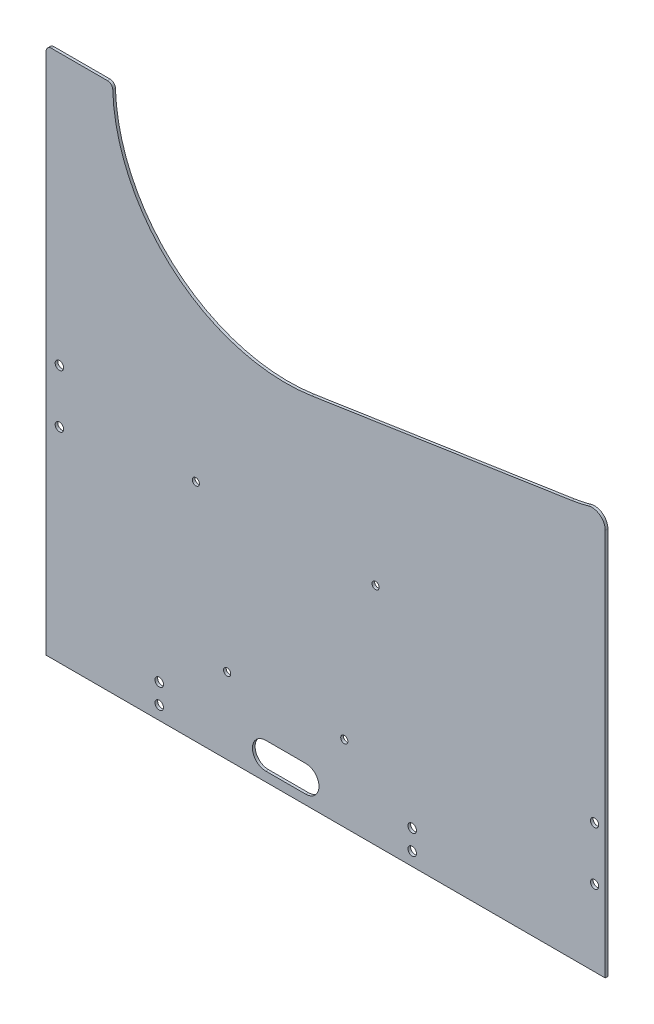
ISO-10303-21;
HEADER;
FILE_DESCRIPTION(('STEP AP214'),'2;1');
FILE_NAME('part.step','',(''),(''),'','','');
FILE_SCHEMA(('AUTOMOTIVE_DESIGN { 1 0 10303 214 1 1 1 1 }'));
ENDSEC;
DATA;
#1=APPLICATION_CONTEXT('core data for automotive mechanical design processes');
#2=APPLICATION_PROTOCOL_DEFINITION('international standard','automotive_design',2000,#1);
#3=PRODUCT_CONTEXT('',#1,'mechanical');
#4=PRODUCT('Part','Part','',(#3));
#5=PRODUCT_RELATED_PRODUCT_CATEGORY('part','',(#4));
#6=PRODUCT_DEFINITION_FORMATION('','',#4);
#7=PRODUCT_DEFINITION_CONTEXT('part definition',#1,'design');
#8=PRODUCT_DEFINITION('design','',#6,#7);
#9=PRODUCT_DEFINITION_SHAPE('','',#8);
#10=(LENGTH_UNIT() NAMED_UNIT(*) SI_UNIT(.MILLI.,.METRE.));
#11=(NAMED_UNIT(*) PLANE_ANGLE_UNIT() SI_UNIT($,.RADIAN.));
#12=(NAMED_UNIT(*) SI_UNIT($,.STERADIAN.) SOLID_ANGLE_UNIT());
#13=UNCERTAINTY_MEASURE_WITH_UNIT(LENGTH_MEASURE(1.E-05),#10,'distance_accuracy_value','');
#14=(GEOMETRIC_REPRESENTATION_CONTEXT(3) GLOBAL_UNCERTAINTY_ASSIGNED_CONTEXT((#13)) GLOBAL_UNIT_ASSIGNED_CONTEXT((#10,
#11,#12)) REPRESENTATION_CONTEXT('',''));
#15=CARTESIAN_POINT('',(0.,0.,0.));
#16=DIRECTION('',(0.,0.,1.));
#17=DIRECTION('',(1.,0.,0.));
#18=AXIS2_PLACEMENT_3D('',#15,#16,#17);
#19=CARTESIAN_POINT('',(105.,-116.5,1.));
#20=DIRECTION('',(-1.,0.,0.));
#21=DIRECTION('',(0.,0.,1.));
#22=AXIS2_PLACEMENT_3D('',#19,#20,#21);
#23=PLANE('',#22);
#24=DIRECTION('',(0.,1.,0.));
#25=VECTOR('',#24,1.);
#26=CARTESIAN_POINT('',(105.,-116.5,1.));
#27=LINE('',#26,#25);
#28=CARTESIAN_POINT('',(105.,-98.249999999998,1.));
#29=VERTEX_POINT('',#28);
#30=CARTESIAN_POINT('',(105.,47.3349737787086,1.));
#31=VERTEX_POINT('',#30);
#32=EDGE_CURVE('E58',#29,#31,#27,.T.);
#33=ORIENTED_EDGE('',*,*,#32,.F.);
#34=DIRECTION('',(0.,0.,1.));
#35=VECTOR('',#34,1.);
#36=CARTESIAN_POINT('',(105.,-98.249999999998,-9.));
#37=LINE('',#36,#35);
#38=CARTESIAN_POINT('',(105.,-98.249999999998,0.));
#39=VERTEX_POINT('',#38);
#40=EDGE_CURVE('E135',#39,#29,#37,.T.);
#41=ORIENTED_EDGE('',*,*,#40,.F.);
#42=DIRECTION('',(0.,1.,0.));
#43=VECTOR('',#42,1.);
#44=CARTESIAN_POINT('',(105.,-116.5,0.));
#45=LINE('',#44,#43);
#46=CARTESIAN_POINT('',(105.,47.3349737787086,0.));
#47=VERTEX_POINT('',#46);
#48=EDGE_CURVE('E154',#39,#47,#45,.T.);
#49=ORIENTED_EDGE('',*,*,#48,.T.);
#50=DIRECTION('',(0.,0.,-1.));
#51=VECTOR('',#50,1.);
#52=CARTESIAN_POINT('',(105.,47.3349737787086,1.));
#53=LINE('',#52,#51);
#54=EDGE_CURVE('E147',#47,#31,#53,.F.);
#55=ORIENTED_EDGE('',*,*,#54,.T.);
#56=EDGE_LOOP('',(#33,#41,#49,#55));
#57=FACE_BOUND('',#56,.T.);
#58=ADVANCED_FACE('F36',(#57),#23,.F.);
#59=CARTESIAN_POINT('',(-105.,-116.5,1.));
#60=DIRECTION('',(1.,0.,0.));
#61=DIRECTION('',(0.,0.,-1.));
#62=AXIS2_PLACEMENT_3D('',#59,#60,#61);
#63=PLANE('',#62);
#64=DIRECTION('',(0.,-1.,0.));
#65=VECTOR('',#64,1.);
#66=CARTESIAN_POINT('',(-105.,-116.5,0.));
#67=LINE('',#66,#65);
#68=CARTESIAN_POINT('',(-105.,98.1500000000003,0.));
#69=VERTEX_POINT('',#68);
#70=CARTESIAN_POINT('',(-105.,-98.249999999998,0.));
#71=VERTEX_POINT('',#70);
#72=EDGE_CURVE('E149',#69,#71,#67,.T.);
#73=ORIENTED_EDGE('',*,*,#72,.T.);
#74=DIRECTION('',(0.,0.,1.));
#75=VECTOR('',#74,1.);
#76=CARTESIAN_POINT('',(-105.,-98.249999999998,-9.));
#77=LINE('',#76,#75);
#78=CARTESIAN_POINT('',(-105.,-98.249999999998,1.));
#79=VERTEX_POINT('',#78);
#80=EDGE_CURVE('E50',#71,#79,#77,.T.);
#81=ORIENTED_EDGE('',*,*,#80,.T.);
#82=DIRECTION('',(0.,-1.,0.));
#83=VECTOR('',#82,1.);
#84=CARTESIAN_POINT('',(-105.,-116.5,1.));
#85=LINE('',#84,#83);
#86=CARTESIAN_POINT('',(-105.,98.1500000000003,1.));
#87=VERTEX_POINT('',#86);
#88=EDGE_CURVE('E144',#87,#79,#85,.T.);
#89=ORIENTED_EDGE('',*,*,#88,.F.);
#90=DIRECTION('',(0.,0.,1.));
#91=VECTOR('',#90,1.);
#92=CARTESIAN_POINT('',(-105.,98.1500000000003,1.));
#93=LINE('',#92,#91);
#94=EDGE_CURVE('E171',#87,#69,#93,.F.);
#95=ORIENTED_EDGE('',*,*,#94,.T.);
#96=EDGE_LOOP('',(#73,#81,#89,#95));
#97=FACE_BOUND('',#96,.T.);
#98=ADVANCED_FACE('F346',(#97),#63,.F.);
#99=CARTESIAN_POINT('',(0.,0.,1.));
#100=DIRECTION('',(0.,0.,-1.));
#101=DIRECTION('',(-1.,0.,0.));
#102=AXIS2_PLACEMENT_3D('',#99,#100,#101);
#103=PLANE('',#102);
#104=CARTESIAN_POINT('',(101.,-49.7499999999996,0.999999999999999));
#105=DIRECTION('',(0.,0.,-1.));
#106=DIRECTION('',(-1.,0.,0.));
#107=AXIS2_PLACEMENT_3D('',#104,#105,#106);
#108=CIRCLE('',#107,1.54999999999999);
#109=CARTESIAN_POINT('',(99.45,-49.7499999999996,0.999999999999999));
#110=VERTEX_POINT('',#109);
#111=EDGE_CURVE('E226',#110,#110,#108,.T.);
#112=ORIENTED_EDGE('',*,*,#111,.T.);
#113=EDGE_LOOP('',(#112));
#114=FACE_BOUND('',#113,.T.);
#115=CARTESIAN_POINT('',(101.,-69.7499999999996,0.999999999999999));
#116=DIRECTION('',(0.,0.,-1.));
#117=DIRECTION('',(-1.,0.,0.));
#118=AXIS2_PLACEMENT_3D('',#115,#116,#117);
#119=CIRCLE('',#118,1.54999999999999);
#120=CARTESIAN_POINT('',(99.45,-69.7499999999996,0.999999999999999));
#121=VERTEX_POINT('',#120);
#122=EDGE_CURVE('E221',#121,#121,#119,.T.);
#123=ORIENTED_EDGE('',*,*,#122,.T.);
#124=EDGE_LOOP('',(#123));
#125=FACE_BOUND('',#124,.T.);
#126=CARTESIAN_POINT('',(-62.4999999999999,-93.249999999998,0.999999999999999));
#127=DIRECTION('',(0.,0.,-1.));
#128=DIRECTION('',(-1.,0.,0.));
#129=AXIS2_PLACEMENT_3D('',#126,#127,#128);
#130=CIRCLE('',#129,1.60000000000002);
#131=CARTESIAN_POINT('',(-64.0999999999999,-93.249999999998,0.999999999999999));
#132=VERTEX_POINT('',#131);
#133=EDGE_CURVE('E250',#132,#132,#130,.T.);
#134=ORIENTED_EDGE('',*,*,#133,.T.);
#135=EDGE_LOOP('',(#134));
#136=FACE_BOUND('',#135,.T.);
#137=CARTESIAN_POINT('',(-62.4999999999999,-85.75,0.999999999999999));
#138=DIRECTION('',(0.,0.,-1.));
#139=DIRECTION('',(-1.,0.,0.));
#140=AXIS2_PLACEMENT_3D('',#137,#138,#139);
#141=CIRCLE('',#140,1.60000000000001);
#142=CARTESIAN_POINT('',(-64.0999999999999,-85.75,0.999999999999999));
#143=VERTEX_POINT('',#142);
#144=EDGE_CURVE('E247',#143,#143,#141,.T.);
#145=ORIENTED_EDGE('',*,*,#144,.T.);
#146=EDGE_LOOP('',(#145));
#147=FACE_BOUND('',#146,.T.);
#148=CARTESIAN_POINT('',(32.5000000000001,-85.75,0.999999999999999));
#149=DIRECTION('',(0.,0.,-1.));
#150=DIRECTION('',(-1.,0.,0.));
#151=AXIS2_PLACEMENT_3D('',#148,#149,#150);
#152=CIRCLE('',#151,1.60000000000001);
#153=CARTESIAN_POINT('',(30.9000000000001,-85.75,0.999999999999999));
#154=VERTEX_POINT('',#153);
#155=EDGE_CURVE('E244',#154,#154,#152,.T.);
#156=ORIENTED_EDGE('',*,*,#155,.T.);
#157=EDGE_LOOP('',(#156));
#158=FACE_BOUND('',#157,.T.);
#159=CARTESIAN_POINT('',(32.5000000000001,-93.249999999998,0.999999999999999));
#160=DIRECTION('',(0.,0.,-1.));
#161=DIRECTION('',(-1.,0.,0.));
#162=AXIS2_PLACEMENT_3D('',#159,#160,#161);
#163=CIRCLE('',#162,1.60000000000001);
#164=CARTESIAN_POINT('',(30.9000000000001,-93.249999999998,0.999999999999999));
#165=VERTEX_POINT('',#164);
#166=EDGE_CURVE('E241',#165,#165,#163,.T.);
#167=ORIENTED_EDGE('',*,*,#166,.T.);
#168=EDGE_LOOP('',(#167));
#169=FACE_BOUND('',#168,.T.);
#170=DIRECTION('',(1.,0.,0.));
#171=VECTOR('',#170,1.);
#172=CARTESIAN_POINT('',(0.,-84.7,1.));
#173=LINE('',#172,#171);
#174=CARTESIAN_POINT('',(-22.4999999999999,-84.7,0.999999999999999));
#175=VERTEX_POINT('',#174);
#176=CARTESIAN_POINT('',(-7.49999999999992,-84.7,0.999999999999999));
#177=VERTEX_POINT('',#176);
#178=EDGE_CURVE('E279',#175,#177,#173,.T.);
#179=ORIENTED_EDGE('',*,*,#178,.T.);
#180=CARTESIAN_POINT('',(-7.49999999999992,-89.7,0.999999999999999));
#181=DIRECTION('',(0.,0.,-1.));
#182=DIRECTION('',(-1.,0.,0.));
#183=AXIS2_PLACEMENT_3D('',#180,#181,#182);
#184=CIRCLE('',#183,5.00000000000002);
#185=CARTESIAN_POINT('',(-7.49999999999992,-94.7000000000001,0.999999999999999));
#186=VERTEX_POINT('',#185);
#187=EDGE_CURVE('E282',#177,#186,#184,.T.);
#188=ORIENTED_EDGE('',*,*,#187,.T.);
#189=DIRECTION('',(-1.,0.,0.));
#190=VECTOR('',#189,1.);
#191=CARTESIAN_POINT('',(0.,-94.7000000000001,1.));
#192=LINE('',#191,#190);
#193=CARTESIAN_POINT('',(-22.4999999999999,-94.7000000000001,1.));
#194=VERTEX_POINT('',#193);
#195=EDGE_CURVE('E267',#186,#194,#192,.T.);
#196=ORIENTED_EDGE('',*,*,#195,.T.);
#197=CARTESIAN_POINT('',(-22.4999999999999,-89.7,0.999999999999999));
#198=DIRECTION('',(0.,0.,-1.));
#199=DIRECTION('',(-1.,0.,0.));
#200=AXIS2_PLACEMENT_3D('',#197,#198,#199);
#201=CIRCLE('',#200,5.00000000000002);
#202=EDGE_CURVE('E276',#194,#175,#201,.T.);
#203=ORIENTED_EDGE('',*,*,#202,.T.);
#204=EDGE_LOOP('',(#179,#188,#196,#203));
#205=FACE_BOUND('',#204,.T.);
#206=CARTESIAN_POINT('',(18.7500000000001,-13.7,0.999999999999999));
#207=DIRECTION('',(0.,0.,-1.));
#208=DIRECTION('',(-1.,0.,0.));
#209=AXIS2_PLACEMENT_3D('',#206,#207,#208);
#210=CIRCLE('',#209,1.35);
#211=CARTESIAN_POINT('',(17.4000000000001,-13.7,0.999999999999999));
#212=VERTEX_POINT('',#211);
#213=EDGE_CURVE('E306',#212,#212,#210,.T.);
#214=ORIENTED_EDGE('',*,*,#213,.T.);
#215=EDGE_LOOP('',(#214));
#216=FACE_BOUND('',#215,.T.);
#217=CARTESIAN_POINT('',(-36.9999999999999,-69.7000000000001,0.999999999999999));
#218=DIRECTION('',(0.,0.,-1.));
#219=DIRECTION('',(-1.,0.,0.));
#220=AXIS2_PLACEMENT_3D('',#217,#218,#219);
#221=CIRCLE('',#220,1.35);
#222=CARTESIAN_POINT('',(-38.3499999999999,-69.7000000000001,0.999999999999999));
#223=VERTEX_POINT('',#222);
#224=EDGE_CURVE('E303',#223,#223,#221,.T.);
#225=ORIENTED_EDGE('',*,*,#224,.T.);
#226=EDGE_LOOP('',(#225));
#227=FACE_BOUND('',#226,.T.);
#228=CARTESIAN_POINT('',(7.00000000000008,-69.7,0.999999999999999));
#229=DIRECTION('',(0.,0.,-1.));
#230=DIRECTION('',(-1.,0.,0.));
#231=AXIS2_PLACEMENT_3D('',#228,#229,#230);
#232=CIRCLE('',#231,1.35);
#233=CARTESIAN_POINT('',(5.65000000000008,-69.7,0.999999999999999));
#234=VERTEX_POINT('',#233);
#235=EDGE_CURVE('E300',#234,#234,#232,.T.);
#236=ORIENTED_EDGE('',*,*,#235,.T.);
#237=EDGE_LOOP('',(#236));
#238=FACE_BOUND('',#237,.T.);
#239=CARTESIAN_POINT('',(-48.7499999999999,-13.7000000000001,0.999999999999999));
#240=DIRECTION('',(0.,0.,-1.));
#241=DIRECTION('',(-1.,0.,0.));
#242=AXIS2_PLACEMENT_3D('',#239,#240,#241);
#243=CIRCLE('',#242,1.35);
#244=CARTESIAN_POINT('',(-50.0999999999999,-13.7000000000001,0.999999999999999));
#245=VERTEX_POINT('',#244);
#246=EDGE_CURVE('E289',#245,#245,#243,.T.);
#247=ORIENTED_EDGE('',*,*,#246,.T.);
#248=EDGE_LOOP('',(#247));
#249=FACE_BOUND('',#248,.T.);
#250=CARTESIAN_POINT('',(-100.,-21.5,1.));
#251=DIRECTION('',(0.,0.,1.));
#252=DIRECTION('',(1.,0.,0.));
#253=AXIS2_PLACEMENT_3D('',#250,#251,#252);
#254=CIRCLE('',#253,1.6);
#255=CARTESIAN_POINT('',(-98.4,-21.5,1.));
#256=VERTEX_POINT('',#255);
#257=EDGE_CURVE('E314',#256,#256,#254,.T.);
#258=ORIENTED_EDGE('',*,*,#257,.F.);
#259=EDGE_LOOP('',(#258));
#260=FACE_BOUND('',#259,.T.);
#261=CARTESIAN_POINT('',(-100.,-1.50000000000004,1.));
#262=DIRECTION('',(0.,0.,1.));
#263=DIRECTION('',(1.,0.,0.));
#264=AXIS2_PLACEMENT_3D('',#261,#262,#263);
#265=CIRCLE('',#264,1.60000000000001);
#266=CARTESIAN_POINT('',(-98.4,-1.50000000000004,1.));
#267=VERTEX_POINT('',#266);
#268=EDGE_CURVE('E309',#267,#267,#265,.T.);
#269=ORIENTED_EDGE('',*,*,#268,.F.);
#270=EDGE_LOOP('',(#269));
#271=FACE_BOUND('',#270,.T.);
#272=ORIENTED_EDGE('',*,*,#88,.T.);
#273=DIRECTION('',(-1.,0.,0.));
#274=VECTOR('',#273,1.);
#275=CARTESIAN_POINT('',(-105.,-98.249999999998,1.));
#276=LINE('',#275,#274);
#277=EDGE_CURVE('E137',#29,#79,#276,.T.);
#278=ORIENTED_EDGE('',*,*,#277,.F.);
#279=ORIENTED_EDGE('',*,*,#32,.T.);
#280=CARTESIAN_POINT('',(100.,47.3349737787086,0.999999999999999));
#281=DIRECTION('',(0.,0.,-1.));
#282=DIRECTION('',(-1.,0.,0.));
#283=AXIS2_PLACEMENT_3D('',#280,#281,#282);
#284=CIRCLE('',#283,5.);
#285=CARTESIAN_POINT('',(98.6363636363636,52.1454307079169,0.999999999999999));
#286=VERTEX_POINT('',#285);
#287=EDGE_CURVE('E44',#31,#286,#284,.F.);
#288=ORIENTED_EDGE('',*,*,#287,.T.);
#289=CARTESIAN_POINT('',(84.9999999999998,100.25,0.999999999999999));
#290=DIRECTION('',(0.,0.,-1.));
#291=DIRECTION('',(-1.,0.,0.));
#292=AXIS2_PLACEMENT_3D('',#289,#290,#291);
#293=CIRCLE('',#292,50.);
#294=CARTESIAN_POINT('',(92.4999999999998,50.8157001667874,0.999999999999999));
#295=VERTEX_POINT('',#294);
#296=EDGE_CURVE('E192',#286,#295,#293,.T.);
#297=ORIENTED_EDGE('',*,*,#296,.T.);
#298=DIRECTION('',(-0.98868599666426,-0.15,0.));
#299=VECTOR('',#298,1.);
#300=CARTESIAN_POINT('',(-5.45486567483886,35.9543287093181,1.));
#301=LINE('',#300,#299);
#302=CARTESIAN_POINT('',(-5.25000000000019,35.9854102168235,0.999999999999999));
#303=VERTEX_POINT('',#302);
#304=EDGE_CURVE('E203',#295,#303,#301,.T.);
#305=ORIENTED_EDGE('',*,*,#304,.T.);
#306=CARTESIAN_POINT('',(-15.0000000000002,100.25,1.));
#307=DIRECTION('',(0.,0.,1.));
#308=DIRECTION('',(1.,0.,0.));
#309=AXIS2_PLACEMENT_3D('',#306,#307,#308);
#310=CIRCLE('',#309,65.);
#311=CARTESIAN_POINT('',(-79.968064108271,98.2126865671645,1.));
#312=VERTEX_POINT('',#311);
#313=EDGE_CURVE('E157',#312,#303,#310,.T.);
#314=ORIENTED_EDGE('',*,*,#313,.F.);
#315=CARTESIAN_POINT('',(-81.9670814654486,98.1500000000003,1.));
#316=DIRECTION('',(0.,0.,-1.));
#317=DIRECTION('',(-1.,0.,0.));
#318=AXIS2_PLACEMENT_3D('',#315,#316,#317);
#319=CIRCLE('',#318,2.);
#320=CARTESIAN_POINT('',(-81.9670814654486,100.15,1.));
#321=VERTEX_POINT('',#320);
#322=EDGE_CURVE('E167',#312,#321,#319,.F.);
#323=ORIENTED_EDGE('',*,*,#322,.T.);
#324=DIRECTION('',(1.,0.,0.));
#325=VECTOR('',#324,1.);
#326=CARTESIAN_POINT('',(-105.,100.15,1.));
#327=LINE('',#326,#325);
#328=CARTESIAN_POINT('',(-103.,100.15,1.));
#329=VERTEX_POINT('',#328);
#330=EDGE_CURVE('E313',#329,#321,#327,.T.);
#331=ORIENTED_EDGE('',*,*,#330,.F.);
#332=CARTESIAN_POINT('',(-103.,98.1500000000003,1.));
#333=DIRECTION('',(0.,0.,-1.));
#334=DIRECTION('',(-1.,0.,0.));
#335=AXIS2_PLACEMENT_3D('',#332,#333,#334);
#336=CIRCLE('',#335,2.);
#337=EDGE_CURVE('E169',#329,#87,#336,.F.);
#338=ORIENTED_EDGE('',*,*,#337,.T.);
#339=EDGE_LOOP('',(#272,#278,#279,#288,#297,#305,#314,#323,#331,#338));
#340=FACE_BOUND('',#339,.T.);
#341=ADVANCED_FACE('F142',(#114,#125,#136,#147,#158,#169,#205,#216,#227,#238,#249,#260,#271,
#340),#103,.F.);
#342=CARTESIAN_POINT('',(0.,0.,0.));
#343=DIRECTION('',(0.,0.,-1.));
#344=DIRECTION('',(-1.,0.,0.));
#345=AXIS2_PLACEMENT_3D('',#342,#343,#344);
#346=PLANE('',#345);
#347=DIRECTION('',(1.,0.,0.));
#348=VECTOR('',#347,1.);
#349=CARTESIAN_POINT('',(0.,-98.249999999998,0.));
#350=LINE('',#349,#348);
#351=EDGE_CURVE('E11',#71,#39,#350,.T.);
#352=ORIENTED_EDGE('',*,*,#351,.F.);
#353=ORIENTED_EDGE('',*,*,#72,.F.);
#354=CARTESIAN_POINT('',(-103.,98.1500000000003,0.));
#355=DIRECTION('',(0.,0.,-1.));
#356=DIRECTION('',(-1.,0.,0.));
#357=AXIS2_PLACEMENT_3D('',#354,#355,#356);
#358=CIRCLE('',#357,2.);
#359=CARTESIAN_POINT('',(-103.,100.15,0.));
#360=VERTEX_POINT('',#359);
#361=EDGE_CURVE('E176',#69,#360,#358,.T.);
#362=ORIENTED_EDGE('',*,*,#361,.T.);
#363=DIRECTION('',(-1.,0.,0.));
#364=VECTOR('',#363,1.);
#365=CARTESIAN_POINT('',(0.,100.15,0.));
#366=LINE('',#365,#364);
#367=CARTESIAN_POINT('',(-81.9670814654486,100.15,0.));
#368=VERTEX_POINT('',#367);
#369=EDGE_CURVE('E323',#368,#360,#366,.T.);
#370=ORIENTED_EDGE('',*,*,#369,.F.);
#371=CARTESIAN_POINT('',(-81.9670814654486,98.1500000000003,0.));
#372=DIRECTION('',(0.,0.,-1.));
#373=DIRECTION('',(-1.,0.,0.));
#374=AXIS2_PLACEMENT_3D('',#371,#372,#373);
#375=CIRCLE('',#374,2.);
#376=CARTESIAN_POINT('',(-79.968064108271,98.2126865671645,0.));
#377=VERTEX_POINT('',#376);
#378=EDGE_CURVE('E173',#368,#377,#375,.T.);
#379=ORIENTED_EDGE('',*,*,#378,.T.);
#380=CARTESIAN_POINT('',(-15.0000000000002,100.25,0.));
#381=DIRECTION('',(0.,0.,-1.));
#382=DIRECTION('',(-1.,0.,0.));
#383=AXIS2_PLACEMENT_3D('',#380,#381,#382);
#384=CIRCLE('',#383,65.);
#385=CARTESIAN_POINT('',(-5.25000000000018,35.9854102168235,0.));
#386=VERTEX_POINT('',#385);
#387=EDGE_CURVE('E151',#386,#377,#384,.T.);
#388=ORIENTED_EDGE('',*,*,#387,.F.);
#389=DIRECTION('',(-0.988685996664259,-0.15,0.));
#390=VECTOR('',#389,1.);
#391=CARTESIAN_POINT('',(92.4999999999998,50.8157001667874,0.));
#392=LINE('',#391,#390);
#393=CARTESIAN_POINT('',(92.4999999999998,50.8157001667874,0.));
#394=VERTEX_POINT('',#393);
#395=EDGE_CURVE('E211',#394,#386,#392,.T.);
#396=ORIENTED_EDGE('',*,*,#395,.F.);
#397=CARTESIAN_POINT('',(84.9999999999998,100.25,0.));
#398=DIRECTION('',(0.,0.,-1.));
#399=DIRECTION('',(-1.,0.,0.));
#400=AXIS2_PLACEMENT_3D('',#397,#398,#399);
#401=CIRCLE('',#400,50.);
#402=CARTESIAN_POINT('',(98.6363636363636,52.1454307079169,0.));
#403=VERTEX_POINT('',#402);
#404=EDGE_CURVE('E209',#403,#394,#401,.T.);
#405=ORIENTED_EDGE('',*,*,#404,.F.);
#406=CARTESIAN_POINT('',(100.,47.3349737787086,0.));
#407=DIRECTION('',(0.,0.,-1.));
#408=DIRECTION('',(-1.,0.,0.));
#409=AXIS2_PLACEMENT_3D('',#406,#407,#408);
#410=CIRCLE('',#409,5.);
#411=EDGE_CURVE('E187',#403,#47,#410,.T.);
#412=ORIENTED_EDGE('',*,*,#411,.T.);
#413=ORIENTED_EDGE('',*,*,#48,.F.);
#414=EDGE_LOOP('',(#352,#353,#362,#370,#379,#388,#396,#405,#412,#413));
#415=FACE_BOUND('',#414,.T.);
#416=CARTESIAN_POINT('',(101.,-49.7499999999996,0.));
#417=DIRECTION('',(0.,0.,-1.));
#418=DIRECTION('',(-1.,0.,0.));
#419=AXIS2_PLACEMENT_3D('',#416,#417,#418);
#420=CIRCLE('',#419,1.54999999999999);
#421=CARTESIAN_POINT('',(99.45,-49.7499999999996,0.));
#422=VERTEX_POINT('',#421);
#423=EDGE_CURVE('E218',#422,#422,#420,.T.);
#424=ORIENTED_EDGE('',*,*,#423,.F.);
#425=EDGE_LOOP('',(#424));
#426=FACE_BOUND('',#425,.T.);
#427=CARTESIAN_POINT('',(101.,-69.7499999999996,0.));
#428=DIRECTION('',(0.,0.,-1.));
#429=DIRECTION('',(-1.,0.,0.));
#430=AXIS2_PLACEMENT_3D('',#427,#428,#429);
#431=CIRCLE('',#430,1.54999999999999);
#432=CARTESIAN_POINT('',(99.45,-69.7499999999996,0.));
#433=VERTEX_POINT('',#432);
#434=EDGE_CURVE('E202',#433,#433,#431,.T.);
#435=ORIENTED_EDGE('',*,*,#434,.F.);
#436=EDGE_LOOP('',(#435));
#437=FACE_BOUND('',#436,.T.);
#438=CARTESIAN_POINT('',(-62.4999999999999,-93.249999999998,0.));
#439=DIRECTION('',(0.,0.,-1.));
#440=DIRECTION('',(-1.,0.,0.));
#441=AXIS2_PLACEMENT_3D('',#438,#439,#440);
#442=CIRCLE('',#441,1.60000000000002);
#443=CARTESIAN_POINT('',(-64.0999999999999,-93.249999999998,0.));
#444=VERTEX_POINT('',#443);
#445=EDGE_CURVE('E229',#444,#444,#442,.T.);
#446=ORIENTED_EDGE('',*,*,#445,.F.);
#447=EDGE_LOOP('',(#446));
#448=FACE_BOUND('',#447,.T.);
#449=CARTESIAN_POINT('',(-62.4999999999999,-85.75,0.));
#450=DIRECTION('',(0.,0.,-1.));
#451=DIRECTION('',(-1.,0.,0.));
#452=AXIS2_PLACEMENT_3D('',#449,#450,#451);
#453=CIRCLE('',#452,1.60000000000001);
#454=CARTESIAN_POINT('',(-64.0999999999999,-85.75,0.));
#455=VERTEX_POINT('',#454);
#456=EDGE_CURVE('E234',#455,#455,#453,.T.);
#457=ORIENTED_EDGE('',*,*,#456,.F.);
#458=EDGE_LOOP('',(#457));
#459=FACE_BOUND('',#458,.T.);
#460=CARTESIAN_POINT('',(32.5000000000001,-85.75,0.));
#461=DIRECTION('',(0.,0.,-1.));
#462=DIRECTION('',(-1.,0.,0.));
#463=AXIS2_PLACEMENT_3D('',#460,#461,#462);
#464=CIRCLE('',#463,1.60000000000001);
#465=CARTESIAN_POINT('',(30.9000000000001,-85.75,0.));
#466=VERTEX_POINT('',#465);
#467=EDGE_CURVE('E230',#466,#466,#464,.T.);
#468=ORIENTED_EDGE('',*,*,#467,.F.);
#469=EDGE_LOOP('',(#468));
#470=FACE_BOUND('',#469,.T.);
#471=CARTESIAN_POINT('',(32.5000000000001,-93.249999999998,0.));
#472=DIRECTION('',(0.,0.,-1.));
#473=DIRECTION('',(-1.,0.,0.));
#474=AXIS2_PLACEMENT_3D('',#471,#472,#473);
#475=CIRCLE('',#474,1.60000000000001);
#476=CARTESIAN_POINT('',(30.9000000000001,-93.249999999998,0.));
#477=VERTEX_POINT('',#476);
#478=EDGE_CURVE('E233',#477,#477,#475,.T.);
#479=ORIENTED_EDGE('',*,*,#478,.F.);
#480=EDGE_LOOP('',(#479));
#481=FACE_BOUND('',#480,.T.);
#482=CARTESIAN_POINT('',(-7.49999999999992,-89.7,0.));
#483=DIRECTION('',(0.,0.,-1.));
#484=DIRECTION('',(-1.,0.,0.));
#485=AXIS2_PLACEMENT_3D('',#482,#483,#484);
#486=CIRCLE('',#485,5.00000000000002);
#487=CARTESIAN_POINT('',(-7.49999999999992,-84.7,0.));
#488=VERTEX_POINT('',#487);
#489=CARTESIAN_POINT('',(-7.49999999999992,-94.7000000000001,0.));
#490=VERTEX_POINT('',#489);
#491=EDGE_CURVE('E253',#488,#490,#486,.T.);
#492=ORIENTED_EDGE('',*,*,#491,.F.);
#493=DIRECTION('',(1.,0.,0.));
#494=VECTOR('',#493,1.);
#495=CARTESIAN_POINT('',(-7.49999999999992,-84.7,0.));
#496=LINE('',#495,#494);
#497=CARTESIAN_POINT('',(-22.4999999999999,-84.7,0.));
#498=VERTEX_POINT('',#497);
#499=EDGE_CURVE('E261',#498,#488,#496,.T.);
#500=ORIENTED_EDGE('',*,*,#499,.F.);
#501=CARTESIAN_POINT('',(-22.4999999999999,-89.7,0.));
#502=DIRECTION('',(0.,0.,-1.));
#503=DIRECTION('',(-1.,0.,0.));
#504=AXIS2_PLACEMENT_3D('',#501,#502,#503);
#505=CIRCLE('',#504,5.00000000000002);
#506=CARTESIAN_POINT('',(-22.4999999999999,-94.7000000000001,0.));
#507=VERTEX_POINT('',#506);
#508=EDGE_CURVE('E258',#507,#498,#505,.T.);
#509=ORIENTED_EDGE('',*,*,#508,.F.);
#510=DIRECTION('',(-1.,0.,0.));
#511=VECTOR('',#510,1.);
#512=CARTESIAN_POINT('',(-7.49999999999992,-94.7000000000001,0.));
#513=LINE('',#512,#511);
#514=EDGE_CURVE('E255',#490,#507,#513,.T.);
#515=ORIENTED_EDGE('',*,*,#514,.F.);
#516=EDGE_LOOP('',(#492,#500,#509,#515));
#517=FACE_BOUND('',#516,.T.);
#518=CARTESIAN_POINT('',(18.7500000000001,-13.7,0.));
#519=DIRECTION('',(0.,0.,-1.));
#520=DIRECTION('',(-1.,0.,0.));
#521=AXIS2_PLACEMENT_3D('',#518,#519,#520);
#522=CIRCLE('',#521,1.35);
#523=CARTESIAN_POINT('',(17.4000000000001,-13.7,0.));
#524=VERTEX_POINT('',#523);
#525=EDGE_CURVE('E286',#524,#524,#522,.T.);
#526=ORIENTED_EDGE('',*,*,#525,.F.);
#527=EDGE_LOOP('',(#526));
#528=FACE_BOUND('',#527,.T.);
#529=CARTESIAN_POINT('',(-36.9999999999999,-69.7000000000001,0.));
#530=DIRECTION('',(0.,0.,-1.));
#531=DIRECTION('',(-1.,0.,0.));
#532=AXIS2_PLACEMENT_3D('',#529,#530,#531);
#533=CIRCLE('',#532,1.35);
#534=CARTESIAN_POINT('',(-38.3499999999999,-69.7000000000001,0.));
#535=VERTEX_POINT('',#534);
#536=EDGE_CURVE('E285',#535,#535,#533,.T.);
#537=ORIENTED_EDGE('',*,*,#536,.F.);
#538=EDGE_LOOP('',(#537));
#539=FACE_BOUND('',#538,.T.);
#540=CARTESIAN_POINT('',(7.00000000000008,-69.7,0.));
#541=DIRECTION('',(0.,0.,-1.));
#542=DIRECTION('',(-1.,0.,0.));
#543=AXIS2_PLACEMENT_3D('',#540,#541,#542);
#544=CIRCLE('',#543,1.35);
#545=CARTESIAN_POINT('',(5.65000000000008,-69.7,0.));
#546=VERTEX_POINT('',#545);
#547=EDGE_CURVE('E293',#546,#546,#544,.T.);
#548=ORIENTED_EDGE('',*,*,#547,.F.);
#549=EDGE_LOOP('',(#548));
#550=FACE_BOUND('',#549,.T.);
#551=CARTESIAN_POINT('',(-48.7499999999999,-13.7000000000001,0.));
#552=DIRECTION('',(0.,0.,-1.));
#553=DIRECTION('',(-1.,0.,0.));
#554=AXIS2_PLACEMENT_3D('',#551,#552,#553);
#555=CIRCLE('',#554,1.35);
#556=CARTESIAN_POINT('',(-50.0999999999999,-13.7000000000001,0.));
#557=VERTEX_POINT('',#556);
#558=EDGE_CURVE('E290',#557,#557,#555,.T.);
#559=ORIENTED_EDGE('',*,*,#558,.F.);
#560=EDGE_LOOP('',(#559));
#561=FACE_BOUND('',#560,.T.);
#562=CARTESIAN_POINT('',(-100.,-21.5,0.));
#563=DIRECTION('',(0.,0.,1.));
#564=DIRECTION('',(1.,0.,0.));
#565=AXIS2_PLACEMENT_3D('',#562,#563,#564);
#566=CIRCLE('',#565,1.6);
#567=CARTESIAN_POINT('',(-98.4,-21.5,0.));
#568=VERTEX_POINT('',#567);
#569=EDGE_CURVE('E310',#568,#568,#566,.T.);
#570=ORIENTED_EDGE('',*,*,#569,.T.);
#571=EDGE_LOOP('',(#570));
#572=FACE_BOUND('',#571,.T.);
#573=CARTESIAN_POINT('',(-100.,-1.50000000000004,0.));
#574=DIRECTION('',(0.,0.,1.));
#575=DIRECTION('',(1.,0.,0.));
#576=AXIS2_PLACEMENT_3D('',#573,#574,#575);
#577=CIRCLE('',#576,1.60000000000001);
#578=CARTESIAN_POINT('',(-98.4,-1.50000000000004,0.));
#579=VERTEX_POINT('',#578);
#580=EDGE_CURVE('E317',#579,#579,#577,.T.);
#581=ORIENTED_EDGE('',*,*,#580,.T.);
#582=EDGE_LOOP('',(#581));
#583=FACE_BOUND('',#582,.T.);
#584=ADVANCED_FACE('F206',(#415,#426,#437,#448,#459,#470,#481,#517,#528,#539,#550,#561,#572,
#583),#346,.T.);
#585=CARTESIAN_POINT('',(-15.0000000000002,100.25,-1.));
#586=DIRECTION('',(0.,0.,1.));
#587=DIRECTION('',(1.,0.,0.));
#588=AXIS2_PLACEMENT_3D('',#585,#586,#587);
#589=CYLINDRICAL_SURFACE('',#588,65.);
#590=ORIENTED_EDGE('',*,*,#313,.T.);
#591=DIRECTION('',(0.,0.,1.));
#592=VECTOR('',#591,1.);
#593=CARTESIAN_POINT('',(-5.2500000000002,35.9854102168235,-1.));
#594=LINE('',#593,#592);
#595=EDGE_CURVE('E181',#303,#386,#594,.F.);
#596=ORIENTED_EDGE('',*,*,#595,.T.);
#597=ORIENTED_EDGE('',*,*,#387,.T.);
#598=DIRECTION('',(0.,0.,1.));
#599=VECTOR('',#598,1.);
#600=CARTESIAN_POINT('',(-79.968064108271,98.2126865671645,-1.));
#601=LINE('',#600,#599);
#602=EDGE_CURVE('E178',#377,#312,#601,.T.);
#603=ORIENTED_EDGE('',*,*,#602,.T.);
#604=EDGE_LOOP('',(#590,#596,#597,#603));
#605=FACE_BOUND('',#604,.T.);
#606=ADVANCED_FACE('F331',(#605),#589,.F.);
#607=CARTESIAN_POINT('',(-105.,100.15,-1.));
#608=DIRECTION('',(0.,-1.,0.));
#609=DIRECTION('',(0.,0.,-1.));
#610=AXIS2_PLACEMENT_3D('',#607,#608,#609);
#611=PLANE('',#610);
#612=ORIENTED_EDGE('',*,*,#369,.T.);
#613=DIRECTION('',(0.,0.,1.));
#614=VECTOR('',#613,1.);
#615=CARTESIAN_POINT('',(-103.,100.15,-1.));
#616=LINE('',#615,#614);
#617=EDGE_CURVE('E164',#360,#329,#616,.T.);
#618=ORIENTED_EDGE('',*,*,#617,.T.);
#619=ORIENTED_EDGE('',*,*,#330,.T.);
#620=DIRECTION('',(0.,0.,1.));
#621=VECTOR('',#620,1.);
#622=CARTESIAN_POINT('',(-81.9670814654486,100.15,-1.));
#623=LINE('',#622,#621);
#624=EDGE_CURVE('E162',#321,#368,#623,.F.);
#625=ORIENTED_EDGE('',*,*,#624,.T.);
#626=EDGE_LOOP('',(#612,#618,#619,#625));
#627=FACE_BOUND('',#626,.T.);
#628=ADVANCED_FACE('F374',(#627),#611,.F.);
#629=CARTESIAN_POINT('',(-100.,-1.50000000000004,0.));
#630=DIRECTION('',(0.,0.,1.));
#631=DIRECTION('',(1.,0.,0.));
#632=AXIS2_PLACEMENT_3D('',#629,#630,#631);
#633=CYLINDRICAL_SURFACE('',#632,1.60000000000001);
#634=ORIENTED_EDGE('',*,*,#580,.F.);
#635=EDGE_LOOP('',(#634));
#636=FACE_BOUND('',#635,.T.);
#637=ORIENTED_EDGE('',*,*,#268,.T.);
#638=EDGE_LOOP('',(#637));
#639=FACE_BOUND('',#638,.T.);
#640=ADVANCED_FACE('F376',(#636,#639),#633,.F.);
#641=CARTESIAN_POINT('',(-100.,-21.5,0.));
#642=DIRECTION('',(0.,0.,1.));
#643=DIRECTION('',(1.,0.,0.));
#644=AXIS2_PLACEMENT_3D('',#641,#642,#643);
#645=CYLINDRICAL_SURFACE('',#644,1.6);
#646=ORIENTED_EDGE('',*,*,#569,.F.);
#647=EDGE_LOOP('',(#646));
#648=FACE_BOUND('',#647,.T.);
#649=ORIENTED_EDGE('',*,*,#257,.T.);
#650=EDGE_LOOP('',(#649));
#651=FACE_BOUND('',#650,.T.);
#652=ADVANCED_FACE('F382',(#648,#651),#645,.F.);
#653=CARTESIAN_POINT('',(-48.7499999999999,-13.7000000000001,10.));
#654=DIRECTION('',(0.,0.,-1.));
#655=DIRECTION('',(-1.,0.,0.));
#656=AXIS2_PLACEMENT_3D('',#653,#654,#655);
#657=CYLINDRICAL_SURFACE('',#656,1.35);
#658=ORIENTED_EDGE('',*,*,#558,.T.);
#659=EDGE_LOOP('',(#658));
#660=FACE_BOUND('',#659,.T.);
#661=ORIENTED_EDGE('',*,*,#246,.F.);
#662=EDGE_LOOP('',(#661));
#663=FACE_BOUND('',#662,.T.);
#664=ADVANCED_FACE('F566',(#660,#663),#657,.F.);
#665=CARTESIAN_POINT('',(7.00000000000008,-69.7,10.));
#666=DIRECTION('',(0.,0.,-1.));
#667=DIRECTION('',(-1.,0.,0.));
#668=AXIS2_PLACEMENT_3D('',#665,#666,#667);
#669=CYLINDRICAL_SURFACE('',#668,1.35);
#670=ORIENTED_EDGE('',*,*,#547,.T.);
#671=EDGE_LOOP('',(#670));
#672=FACE_BOUND('',#671,.T.);
#673=ORIENTED_EDGE('',*,*,#235,.F.);
#674=EDGE_LOOP('',(#673));
#675=FACE_BOUND('',#674,.T.);
#676=ADVANCED_FACE('F556',(#672,#675),#669,.F.);
#677=CARTESIAN_POINT('',(-36.9999999999999,-69.7000000000001,10.));
#678=DIRECTION('',(0.,0.,-1.));
#679=DIRECTION('',(-1.,0.,0.));
#680=AXIS2_PLACEMENT_3D('',#677,#678,#679);
#681=CYLINDRICAL_SURFACE('',#680,1.35);
#682=ORIENTED_EDGE('',*,*,#536,.T.);
#683=EDGE_LOOP('',(#682));
#684=FACE_BOUND('',#683,.T.);
#685=ORIENTED_EDGE('',*,*,#224,.F.);
#686=EDGE_LOOP('',(#685));
#687=FACE_BOUND('',#686,.T.);
#688=ADVANCED_FACE('F546',(#684,#687),#681,.F.);
#689=CARTESIAN_POINT('',(18.7500000000001,-13.7,10.));
#690=DIRECTION('',(0.,0.,-1.));
#691=DIRECTION('',(-1.,0.,0.));
#692=AXIS2_PLACEMENT_3D('',#689,#690,#691);
#693=CYLINDRICAL_SURFACE('',#692,1.35);
#694=ORIENTED_EDGE('',*,*,#525,.T.);
#695=EDGE_LOOP('',(#694));
#696=FACE_BOUND('',#695,.T.);
#697=ORIENTED_EDGE('',*,*,#213,.F.);
#698=EDGE_LOOP('',(#697));
#699=FACE_BOUND('',#698,.T.);
#700=ADVANCED_FACE('F536',(#696,#699),#693,.F.);
#701=CARTESIAN_POINT('',(-7.49999999999992,-89.7,10.));
#702=DIRECTION('',(0.,0.,-1.));
#703=DIRECTION('',(-1.,0.,0.));
#704=AXIS2_PLACEMENT_3D('',#701,#702,#703);
#705=CYLINDRICAL_SURFACE('',#704,5.00000000000002);
#706=DIRECTION('',(0.,0.,-1.));
#707=VECTOR('',#706,1.);
#708=CARTESIAN_POINT('',(-7.49999999999992,-84.7,10.));
#709=LINE('',#708,#707);
#710=EDGE_CURVE('E265',#177,#488,#709,.T.);
#711=ORIENTED_EDGE('',*,*,#710,.T.);
#712=ORIENTED_EDGE('',*,*,#491,.T.);
#713=DIRECTION('',(0.,0.,-1.));
#714=VECTOR('',#713,1.);
#715=CARTESIAN_POINT('',(-7.49999999999992,-94.7000000000001,10.));
#716=LINE('',#715,#714);
#717=EDGE_CURVE('E264',#186,#490,#716,.T.);
#718=ORIENTED_EDGE('',*,*,#717,.F.);
#719=ORIENTED_EDGE('',*,*,#187,.F.);
#720=EDGE_LOOP('',(#711,#712,#718,#719));
#721=FACE_BOUND('',#720,.T.);
#722=ADVANCED_FACE('F526',(#721),#705,.F.);
#723=CARTESIAN_POINT('',(-7.49999999999992,-84.7,10.));
#724=DIRECTION('',(0.,1.,0.));
#725=DIRECTION('',(0.,0.,1.));
#726=AXIS2_PLACEMENT_3D('',#723,#724,#725);
#727=PLANE('',#726);
#728=DIRECTION('',(0.,0.,-1.));
#729=VECTOR('',#728,1.);
#730=CARTESIAN_POINT('',(-22.4999999999999,-84.7,10.));
#731=LINE('',#730,#729);
#732=EDGE_CURVE('E268',#175,#498,#731,.T.);
#733=ORIENTED_EDGE('',*,*,#732,.T.);
#734=ORIENTED_EDGE('',*,*,#499,.T.);
#735=ORIENTED_EDGE('',*,*,#710,.F.);
#736=ORIENTED_EDGE('',*,*,#178,.F.);
#737=EDGE_LOOP('',(#733,#734,#735,#736));
#738=FACE_BOUND('',#737,.T.);
#739=ADVANCED_FACE('F516',(#738),#727,.F.);
#740=CARTESIAN_POINT('',(-22.4999999999999,-89.7,10.));
#741=DIRECTION('',(0.,0.,-1.));
#742=DIRECTION('',(-1.,0.,0.));
#743=AXIS2_PLACEMENT_3D('',#740,#741,#742);
#744=CYLINDRICAL_SURFACE('',#743,5.00000000000002);
#745=DIRECTION('',(0.,0.,-1.));
#746=VECTOR('',#745,1.);
#747=CARTESIAN_POINT('',(-22.4999999999999,-94.7000000000001,10.));
#748=LINE('',#747,#746);
#749=EDGE_CURVE('E270',#194,#507,#748,.T.);
#750=ORIENTED_EDGE('',*,*,#749,.T.);
#751=ORIENTED_EDGE('',*,*,#508,.T.);
#752=ORIENTED_EDGE('',*,*,#732,.F.);
#753=ORIENTED_EDGE('',*,*,#202,.F.);
#754=EDGE_LOOP('',(#750,#751,#752,#753));
#755=FACE_BOUND('',#754,.T.);
#756=ADVANCED_FACE('F506',(#755),#744,.F.);
#757=CARTESIAN_POINT('',(-7.49999999999992,-94.7000000000001,10.));
#758=DIRECTION('',(0.,-1.,0.));
#759=DIRECTION('',(0.,0.,-1.));
#760=AXIS2_PLACEMENT_3D('',#757,#758,#759);
#761=PLANE('',#760);
#762=ORIENTED_EDGE('',*,*,#717,.T.);
#763=ORIENTED_EDGE('',*,*,#514,.T.);
#764=ORIENTED_EDGE('',*,*,#749,.F.);
#765=ORIENTED_EDGE('',*,*,#195,.F.);
#766=EDGE_LOOP('',(#762,#763,#764,#765));
#767=FACE_BOUND('',#766,.T.);
#768=ADVANCED_FACE('F358',(#767),#761,.F.);
#769=CARTESIAN_POINT('',(-103.,98.1500000000003,-1.));
#770=DIRECTION('',(0.,0.,1.));
#771=DIRECTION('',(1.,0.,0.));
#772=AXIS2_PLACEMENT_3D('',#769,#770,#771);
#773=CYLINDRICAL_SURFACE('',#772,2.);
#774=ORIENTED_EDGE('',*,*,#361,.F.);
#775=ORIENTED_EDGE('',*,*,#94,.F.);
#776=ORIENTED_EDGE('',*,*,#337,.F.);
#777=ORIENTED_EDGE('',*,*,#617,.F.);
#778=EDGE_LOOP('',(#774,#775,#776,#777));
#779=FACE_BOUND('',#778,.T.);
#780=ADVANCED_FACE('F355',(#779),#773,.T.);
#781=CARTESIAN_POINT('',(-81.9670814654486,98.1500000000003,-1.));
#782=DIRECTION('',(0.,0.,1.));
#783=DIRECTION('',(1.,0.,0.));
#784=AXIS2_PLACEMENT_3D('',#781,#782,#783);
#785=CYLINDRICAL_SURFACE('',#784,2.);
#786=ORIENTED_EDGE('',*,*,#378,.F.);
#787=ORIENTED_EDGE('',*,*,#624,.F.);
#788=ORIENTED_EDGE('',*,*,#322,.F.);
#789=ORIENTED_EDGE('',*,*,#602,.F.);
#790=EDGE_LOOP('',(#786,#787,#788,#789));
#791=FACE_BOUND('',#790,.T.);
#792=ADVANCED_FACE('F357',(#791),#785,.T.);
#793=CARTESIAN_POINT('',(32.5000000000001,-93.249999999998,10.));
#794=DIRECTION('',(0.,0.,-1.));
#795=DIRECTION('',(-1.,0.,0.));
#796=AXIS2_PLACEMENT_3D('',#793,#794,#795);
#797=CYLINDRICAL_SURFACE('',#796,1.60000000000001);
#798=ORIENTED_EDGE('',*,*,#478,.T.);
#799=EDGE_LOOP('',(#798));
#800=FACE_BOUND('',#799,.T.);
#801=ORIENTED_EDGE('',*,*,#166,.F.);
#802=EDGE_LOOP('',(#801));
#803=FACE_BOUND('',#802,.T.);
#804=ADVANCED_FACE('F361',(#800,#803),#797,.F.);
#805=CARTESIAN_POINT('',(32.5000000000001,-85.75,10.));
#806=DIRECTION('',(0.,0.,-1.));
#807=DIRECTION('',(-1.,0.,0.));
#808=AXIS2_PLACEMENT_3D('',#805,#806,#807);
#809=CYLINDRICAL_SURFACE('',#808,1.60000000000001);
#810=ORIENTED_EDGE('',*,*,#467,.T.);
#811=EDGE_LOOP('',(#810));
#812=FACE_BOUND('',#811,.T.);
#813=ORIENTED_EDGE('',*,*,#155,.F.);
#814=EDGE_LOOP('',(#813));
#815=FACE_BOUND('',#814,.T.);
#816=ADVANCED_FACE('F366',(#812,#815),#809,.F.);
#817=CARTESIAN_POINT('',(-62.4999999999999,-85.75,10.));
#818=DIRECTION('',(0.,0.,-1.));
#819=DIRECTION('',(-1.,0.,0.));
#820=AXIS2_PLACEMENT_3D('',#817,#818,#819);
#821=CYLINDRICAL_SURFACE('',#820,1.60000000000001);
#822=ORIENTED_EDGE('',*,*,#456,.T.);
#823=EDGE_LOOP('',(#822));
#824=FACE_BOUND('',#823,.T.);
#825=ORIENTED_EDGE('',*,*,#144,.F.);
#826=EDGE_LOOP('',(#825));
#827=FACE_BOUND('',#826,.T.);
#828=ADVANCED_FACE('F463',(#824,#827),#821,.F.);
#829=CARTESIAN_POINT('',(-62.4999999999999,-93.249999999998,10.));
#830=DIRECTION('',(0.,0.,-1.));
#831=DIRECTION('',(-1.,0.,0.));
#832=AXIS2_PLACEMENT_3D('',#829,#830,#831);
#833=CYLINDRICAL_SURFACE('',#832,1.60000000000002);
#834=ORIENTED_EDGE('',*,*,#445,.T.);
#835=EDGE_LOOP('',(#834));
#836=FACE_BOUND('',#835,.T.);
#837=ORIENTED_EDGE('',*,*,#133,.F.);
#838=EDGE_LOOP('',(#837));
#839=FACE_BOUND('',#838,.T.);
#840=ADVANCED_FACE('F455',(#836,#839),#833,.F.);
#841=CARTESIAN_POINT('',(101.,-69.7499999999996,10.));
#842=DIRECTION('',(0.,0.,-1.));
#843=DIRECTION('',(-1.,0.,0.));
#844=AXIS2_PLACEMENT_3D('',#841,#842,#843);
#845=CYLINDRICAL_SURFACE('',#844,1.54999999999999);
#846=ORIENTED_EDGE('',*,*,#434,.T.);
#847=EDGE_LOOP('',(#846));
#848=FACE_BOUND('',#847,.T.);
#849=ORIENTED_EDGE('',*,*,#122,.F.);
#850=EDGE_LOOP('',(#849));
#851=FACE_BOUND('',#850,.T.);
#852=ADVANCED_FACE('F450',(#848,#851),#845,.F.);
#853=CARTESIAN_POINT('',(101.,-49.7499999999996,10.));
#854=DIRECTION('',(0.,0.,-1.));
#855=DIRECTION('',(-1.,0.,0.));
#856=AXIS2_PLACEMENT_3D('',#853,#854,#855);
#857=CYLINDRICAL_SURFACE('',#856,1.54999999999999);
#858=ORIENTED_EDGE('',*,*,#423,.T.);
#859=EDGE_LOOP('',(#858));
#860=FACE_BOUND('',#859,.T.);
#861=ORIENTED_EDGE('',*,*,#111,.F.);
#862=EDGE_LOOP('',(#861));
#863=FACE_BOUND('',#862,.T.);
#864=ADVANCED_FACE('F342',(#860,#863),#857,.F.);
#865=CARTESIAN_POINT('',(84.9999999999998,100.25,10.));
#866=DIRECTION('',(0.,0.,-1.));
#867=DIRECTION('',(-1.,0.,0.));
#868=AXIS2_PLACEMENT_3D('',#865,#866,#867);
#869=CYLINDRICAL_SURFACE('',#868,50.);
#870=ORIENTED_EDGE('',*,*,#296,.F.);
#871=DIRECTION('',(0.,0.,-1.));
#872=VECTOR('',#871,1.);
#873=CARTESIAN_POINT('',(98.6363636363636,52.1454307079169,10.));
#874=LINE('',#873,#872);
#875=EDGE_CURVE('E184',#286,#403,#874,.T.);
#876=ORIENTED_EDGE('',*,*,#875,.T.);
#877=ORIENTED_EDGE('',*,*,#404,.T.);
#878=DIRECTION('',(0.,0.,-1.));
#879=VECTOR('',#878,1.);
#880=CARTESIAN_POINT('',(92.4999999999998,50.8157001667874,10.));
#881=LINE('',#880,#879);
#882=EDGE_CURVE('E201',#295,#394,#881,.T.);
#883=ORIENTED_EDGE('',*,*,#882,.F.);
#884=EDGE_LOOP('',(#870,#876,#877,#883));
#885=FACE_BOUND('',#884,.T.);
#886=ADVANCED_FACE('F198',(#885),#869,.F.);
#887=CARTESIAN_POINT('',(92.4999999999998,50.8157001667874,10.));
#888=DIRECTION('',(0.15,-0.988685996664259,0.));
#889=DIRECTION('',(0.98868599666426,0.15,0.));
#890=AXIS2_PLACEMENT_3D('',#887,#888,#889);
#891=PLANE('',#890);
#892=ORIENTED_EDGE('',*,*,#882,.T.);
#893=ORIENTED_EDGE('',*,*,#395,.T.);
#894=ORIENTED_EDGE('',*,*,#595,.F.);
#895=ORIENTED_EDGE('',*,*,#304,.F.);
#896=EDGE_LOOP('',(#892,#893,#894,#895));
#897=FACE_BOUND('',#896,.T.);
#898=ADVANCED_FACE('F335',(#897),#891,.F.);
#899=CARTESIAN_POINT('',(100.,47.3349737787086,10.));
#900=DIRECTION('',(0.,0.,-1.));
#901=DIRECTION('',(-1.,0.,0.));
#902=AXIS2_PLACEMENT_3D('',#899,#900,#901);
#903=CYLINDRICAL_SURFACE('',#902,5.);
#904=ORIENTED_EDGE('',*,*,#287,.F.);
#905=ORIENTED_EDGE('',*,*,#54,.F.);
#906=ORIENTED_EDGE('',*,*,#411,.F.);
#907=ORIENTED_EDGE('',*,*,#875,.F.);
#908=EDGE_LOOP('',(#904,#905,#906,#907));
#909=FACE_BOUND('',#908,.T.);
#910=ADVANCED_FACE('F38',(#909),#903,.T.);
#911=CARTESIAN_POINT('',(-105.,-98.249999999998,-9.));
#912=DIRECTION('',(0.,1.,0.));
#913=DIRECTION('',(0.,0.,1.));
#914=AXIS2_PLACEMENT_3D('',#911,#912,#913);
#915=PLANE('',#914);
#916=ORIENTED_EDGE('',*,*,#351,.T.);
#917=ORIENTED_EDGE('',*,*,#40,.T.);
#918=ORIENTED_EDGE('',*,*,#277,.T.);
#919=ORIENTED_EDGE('',*,*,#80,.F.);
#920=EDGE_LOOP('',(#916,#917,#918,#919));
#921=FACE_BOUND('',#920,.T.);
#922=ADVANCED_FACE('F136',(#921),#915,.F.);
#923=CLOSED_SHELL('',(#58,#98,#341,#584,#606,#628,#640,#652,#664,#676,#688,#700,#722,#739,#756,
#768,#780,#792,#804,#816,#828,#840,#852,#864,#886,#898,#910,#922));
#924=MANIFOLD_SOLID_BREP('B2',#923);
#925=ADVANCED_BREP_SHAPE_REPRESENTATION('',(#18,#924),#14);
#926=SHAPE_DEFINITION_REPRESENTATION(#9,#925);
ENDSEC;
END-ISO-10303-21;
